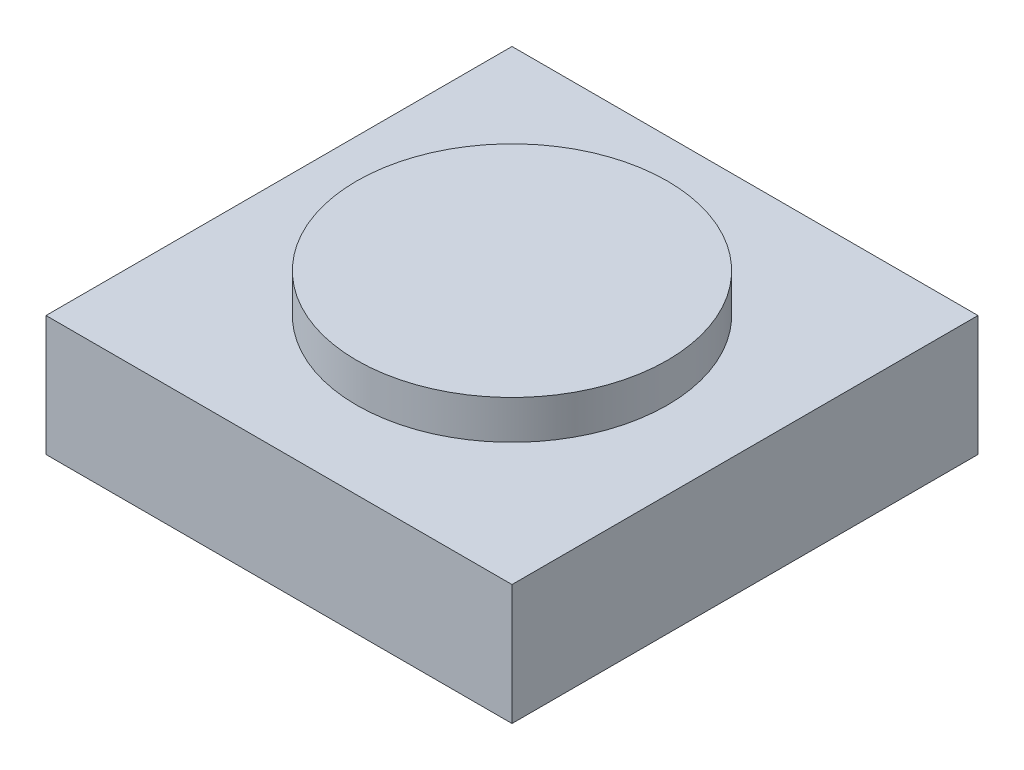
ISO-10303-21;
HEADER;
FILE_DESCRIPTION(('STEP AP214'),'2;1');
FILE_NAME('part.step','',(''),(''),'','','');
FILE_SCHEMA(('AUTOMOTIVE_DESIGN { 1 0 10303 214 1 1 1 1 }'));
ENDSEC;
DATA;
#1=APPLICATION_CONTEXT('core data for automotive mechanical design processes');
#2=APPLICATION_PROTOCOL_DEFINITION('international standard','automotive_design',2000,#1);
#3=PRODUCT_CONTEXT('',#1,'mechanical');
#4=PRODUCT('Part','Part','',(#3));
#5=PRODUCT_RELATED_PRODUCT_CATEGORY('part','',(#4));
#6=PRODUCT_DEFINITION_FORMATION('','',#4);
#7=PRODUCT_DEFINITION_CONTEXT('part definition',#1,'design');
#8=PRODUCT_DEFINITION('design','',#6,#7);
#9=PRODUCT_DEFINITION_SHAPE('','',#8);
#10=(LENGTH_UNIT() NAMED_UNIT(*) SI_UNIT(.MILLI.,.METRE.));
#11=(NAMED_UNIT(*) PLANE_ANGLE_UNIT() SI_UNIT($,.RADIAN.));
#12=(NAMED_UNIT(*) SI_UNIT($,.STERADIAN.) SOLID_ANGLE_UNIT());
#13=UNCERTAINTY_MEASURE_WITH_UNIT(LENGTH_MEASURE(1.E-05),#10,'distance_accuracy_value','');
#14=(GEOMETRIC_REPRESENTATION_CONTEXT(3) GLOBAL_UNCERTAINTY_ASSIGNED_CONTEXT((#13)) GLOBAL_UNIT_ASSIGNED_CONTEXT((#10,
#11,#12)) REPRESENTATION_CONTEXT('',''));
#15=CARTESIAN_POINT('',(0.,0.,0.));
#16=DIRECTION('',(0.,0.,1.));
#17=DIRECTION('',(1.,0.,0.));
#18=AXIS2_PLACEMENT_3D('',#15,#16,#17);
#19=CARTESIAN_POINT('',(-6.,3.1,-6.));
#20=DIRECTION('',(0.,1.,0.));
#21=DIRECTION('',(0.,0.,1.));
#22=AXIS2_PLACEMENT_3D('',#19,#20,#21);
#23=PLANE('',#22);
#24=DIRECTION('',(0.,0.,1.));
#25=VECTOR('',#24,1.);
#26=CARTESIAN_POINT('',(-6.,3.1,-6.));
#27=LINE('',#26,#25);
#28=CARTESIAN_POINT('',(-6.,3.1,-6.));
#29=VERTEX_POINT('',#28);
#30=CARTESIAN_POINT('',(-6.,3.1,6.));
#31=VERTEX_POINT('',#30);
#32=EDGE_CURVE('E102',#29,#31,#27,.T.);
#33=ORIENTED_EDGE('',*,*,#32,.T.);
#34=DIRECTION('',(1.,0.,0.));
#35=VECTOR('',#34,1.);
#36=CARTESIAN_POINT('',(-6.,3.1,6.));
#37=LINE('',#36,#35);
#38=CARTESIAN_POINT('',(6.00000000000003,3.1,6.));
#39=VERTEX_POINT('',#38);
#40=EDGE_CURVE('E87',#31,#39,#37,.T.);
#41=ORIENTED_EDGE('',*,*,#40,.T.);
#42=DIRECTION('',(0.,0.,-1.));
#43=VECTOR('',#42,1.);
#44=CARTESIAN_POINT('',(6.,3.1,-6.));
#45=LINE('',#44,#43);
#46=CARTESIAN_POINT('',(6.,3.1,-6.));
#47=VERTEX_POINT('',#46);
#48=EDGE_CURVE('E54',#39,#47,#45,.T.);
#49=ORIENTED_EDGE('',*,*,#48,.T.);
#50=DIRECTION('',(-1.,0.,0.));
#51=VECTOR('',#50,1.);
#52=CARTESIAN_POINT('',(-6.,3.1,-6.));
#53=LINE('',#52,#51);
#54=EDGE_CURVE('E49',#47,#29,#53,.T.);
#55=ORIENTED_EDGE('',*,*,#54,.T.);
#56=EDGE_LOOP('',(#33,#41,#49,#55));
#57=FACE_BOUND('',#56,.T.);
#58=CARTESIAN_POINT('',(0.,3.1,0.));
#59=DIRECTION('',(0.,1.,0.));
#60=DIRECTION('',(0.,0.,1.));
#61=AXIS2_PLACEMENT_3D('',#58,#59,#60);
#62=CIRCLE('',#61,4.);
#63=CARTESIAN_POINT('',(0.,3.1,4.));
#64=VERTEX_POINT('',#63);
#65=EDGE_CURVE('E95',#64,#64,#62,.T.);
#66=ORIENTED_EDGE('',*,*,#65,.F.);
#67=EDGE_LOOP('',(#66));
#68=FACE_BOUND('',#67,.T.);
#69=ADVANCED_FACE('F34',(#57,#68),#23,.T.);
#70=CARTESIAN_POINT('',(-6.,3.1,-6.));
#71=DIRECTION('',(1.,0.,0.));
#72=DIRECTION('',(0.,0.,-1.));
#73=AXIS2_PLACEMENT_3D('',#70,#71,#72);
#74=PLANE('',#73);
#75=DIRECTION('',(0.,0.,1.));
#76=VECTOR('',#75,1.);
#77=CARTESIAN_POINT('',(-6.,0.,-6.));
#78=LINE('',#77,#76);
#79=CARTESIAN_POINT('',(-6.,0.,-6.));
#80=VERTEX_POINT('',#79);
#81=CARTESIAN_POINT('',(-6.,0.,6.));
#82=VERTEX_POINT('',#81);
#83=EDGE_CURVE('E79',#80,#82,#78,.T.);
#84=ORIENTED_EDGE('',*,*,#83,.T.);
#85=DIRECTION('',(0.,-1.,0.));
#86=VECTOR('',#85,1.);
#87=CARTESIAN_POINT('',(-6.,3.1,6.));
#88=LINE('',#87,#86);
#89=EDGE_CURVE('E11',#31,#82,#88,.T.);
#90=ORIENTED_EDGE('',*,*,#89,.F.);
#91=ORIENTED_EDGE('',*,*,#32,.F.);
#92=DIRECTION('',(0.,-1.,0.));
#93=VECTOR('',#92,1.);
#94=CARTESIAN_POINT('',(-6.,3.1,-6.));
#95=LINE('',#94,#93);
#96=EDGE_CURVE('E91',#29,#80,#95,.T.);
#97=ORIENTED_EDGE('',*,*,#96,.T.);
#98=EDGE_LOOP('',(#84,#90,#91,#97));
#99=FACE_BOUND('',#98,.T.);
#100=ADVANCED_FACE('F36',(#99),#74,.F.);
#101=CARTESIAN_POINT('',(-6.,3.1,6.));
#102=DIRECTION('',(0.,0.,-1.));
#103=DIRECTION('',(-1.,0.,0.));
#104=AXIS2_PLACEMENT_3D('',#101,#102,#103);
#105=PLANE('',#104);
#106=DIRECTION('',(1.,0.,0.));
#107=VECTOR('',#106,1.);
#108=CARTESIAN_POINT('',(-6.,0.,6.));
#109=LINE('',#108,#107);
#110=CARTESIAN_POINT('',(6.00000000000003,0.,6.));
#111=VERTEX_POINT('',#110);
#112=EDGE_CURVE('E75',#82,#111,#109,.T.);
#113=ORIENTED_EDGE('',*,*,#112,.T.);
#114=DIRECTION('',(0.,-1.,0.));
#115=VECTOR('',#114,1.);
#116=CARTESIAN_POINT('',(6.00000000000003,3.1,6.));
#117=LINE('',#116,#115);
#118=EDGE_CURVE('E42',#39,#111,#117,.T.);
#119=ORIENTED_EDGE('',*,*,#118,.F.);
#120=ORIENTED_EDGE('',*,*,#40,.F.);
#121=ORIENTED_EDGE('',*,*,#89,.T.);
#122=EDGE_LOOP('',(#113,#119,#120,#121));
#123=FACE_BOUND('',#122,.T.);
#124=ADVANCED_FACE('F86',(#123),#105,.F.);
#125=CARTESIAN_POINT('',(6.,3.1,-6.));
#126=DIRECTION('',(-1.,0.,0.));
#127=DIRECTION('',(0.,0.,1.));
#128=AXIS2_PLACEMENT_3D('',#125,#126,#127);
#129=PLANE('',#128);
#130=DIRECTION('',(0.,0.,-1.));
#131=VECTOR('',#130,1.);
#132=CARTESIAN_POINT('',(6.,0.,-6.));
#133=LINE('',#132,#131);
#134=CARTESIAN_POINT('',(6.,0.,-6.));
#135=VERTEX_POINT('',#134);
#136=EDGE_CURVE('E80',#111,#135,#133,.T.);
#137=ORIENTED_EDGE('',*,*,#136,.T.);
#138=DIRECTION('',(0.,-1.,0.));
#139=VECTOR('',#138,1.);
#140=CARTESIAN_POINT('',(6.,3.1,-6.));
#141=LINE('',#140,#139);
#142=EDGE_CURVE('E108',#47,#135,#141,.T.);
#143=ORIENTED_EDGE('',*,*,#142,.F.);
#144=ORIENTED_EDGE('',*,*,#48,.F.);
#145=ORIENTED_EDGE('',*,*,#118,.T.);
#146=EDGE_LOOP('',(#137,#143,#144,#145));
#147=FACE_BOUND('',#146,.T.);
#148=ADVANCED_FACE('F111',(#147),#129,.F.);
#149=CARTESIAN_POINT('',(-6.,3.1,-6.));
#150=DIRECTION('',(0.,0.,1.));
#151=DIRECTION('',(1.,0.,0.));
#152=AXIS2_PLACEMENT_3D('',#149,#150,#151);
#153=PLANE('',#152);
#154=DIRECTION('',(-1.,0.,0.));
#155=VECTOR('',#154,1.);
#156=CARTESIAN_POINT('',(-6.,0.,-6.));
#157=LINE('',#156,#155);
#158=EDGE_CURVE('E100',#135,#80,#157,.T.);
#159=ORIENTED_EDGE('',*,*,#158,.T.);
#160=ORIENTED_EDGE('',*,*,#96,.F.);
#161=ORIENTED_EDGE('',*,*,#54,.F.);
#162=ORIENTED_EDGE('',*,*,#142,.T.);
#163=EDGE_LOOP('',(#159,#160,#161,#162));
#164=FACE_BOUND('',#163,.T.);
#165=ADVANCED_FACE('F113',(#164),#153,.F.);
#166=CARTESIAN_POINT('',(-6.,0.,-6.));
#167=DIRECTION('',(0.,1.,0.));
#168=DIRECTION('',(0.,0.,1.));
#169=AXIS2_PLACEMENT_3D('',#166,#167,#168);
#170=PLANE('',#169);
#171=ORIENTED_EDGE('',*,*,#83,.F.);
#172=ORIENTED_EDGE('',*,*,#158,.F.);
#173=ORIENTED_EDGE('',*,*,#136,.F.);
#174=ORIENTED_EDGE('',*,*,#112,.F.);
#175=EDGE_LOOP('',(#171,#172,#173,#174));
#176=FACE_BOUND('',#175,.T.);
#177=ADVANCED_FACE('F76',(#176),#170,.F.);
#178=CARTESIAN_POINT('',(0.,4.1,0.));
#179=DIRECTION('',(0.,-1.,0.));
#180=DIRECTION('',(0.,0.,-1.));
#181=AXIS2_PLACEMENT_3D('',#178,#179,#180);
#182=CYLINDRICAL_SURFACE('',#181,4.);
#183=CARTESIAN_POINT('',(0.,4.1,0.));
#184=DIRECTION('',(0.,1.,0.));
#185=DIRECTION('',(0.,0.,1.));
#186=AXIS2_PLACEMENT_3D('',#183,#184,#185);
#187=CIRCLE('',#186,4.);
#188=CARTESIAN_POINT('',(0.,4.1,4.));
#189=VERTEX_POINT('',#188);
#190=EDGE_CURVE('E92',#189,#189,#187,.T.);
#191=ORIENTED_EDGE('',*,*,#190,.F.);
#192=EDGE_LOOP('',(#191));
#193=FACE_BOUND('',#192,.T.);
#194=ORIENTED_EDGE('',*,*,#65,.T.);
#195=EDGE_LOOP('',(#194));
#196=FACE_BOUND('',#195,.T.);
#197=ADVANCED_FACE('F120',(#193,#196),#182,.T.);
#198=CARTESIAN_POINT('',(0.,4.1,0.));
#199=DIRECTION('',(0.,1.,0.));
#200=DIRECTION('',(0.,0.,1.));
#201=AXIS2_PLACEMENT_3D('',#198,#199,#200);
#202=PLANE('',#201);
#203=ORIENTED_EDGE('',*,*,#190,.T.);
#204=EDGE_LOOP('',(#203));
#205=FACE_BOUND('',#204,.T.);
#206=ADVANCED_FACE('F122',(#205),#202,.T.);
#207=CLOSED_SHELL('',(#69,#100,#124,#148,#165,#177,#197,#206));
#208=MANIFOLD_SOLID_BREP('B2',#207);
#209=ADVANCED_BREP_SHAPE_REPRESENTATION('',(#18,#208),#14);
#210=SHAPE_DEFINITION_REPRESENTATION(#9,#209);
ENDSEC;
END-ISO-10303-21;
